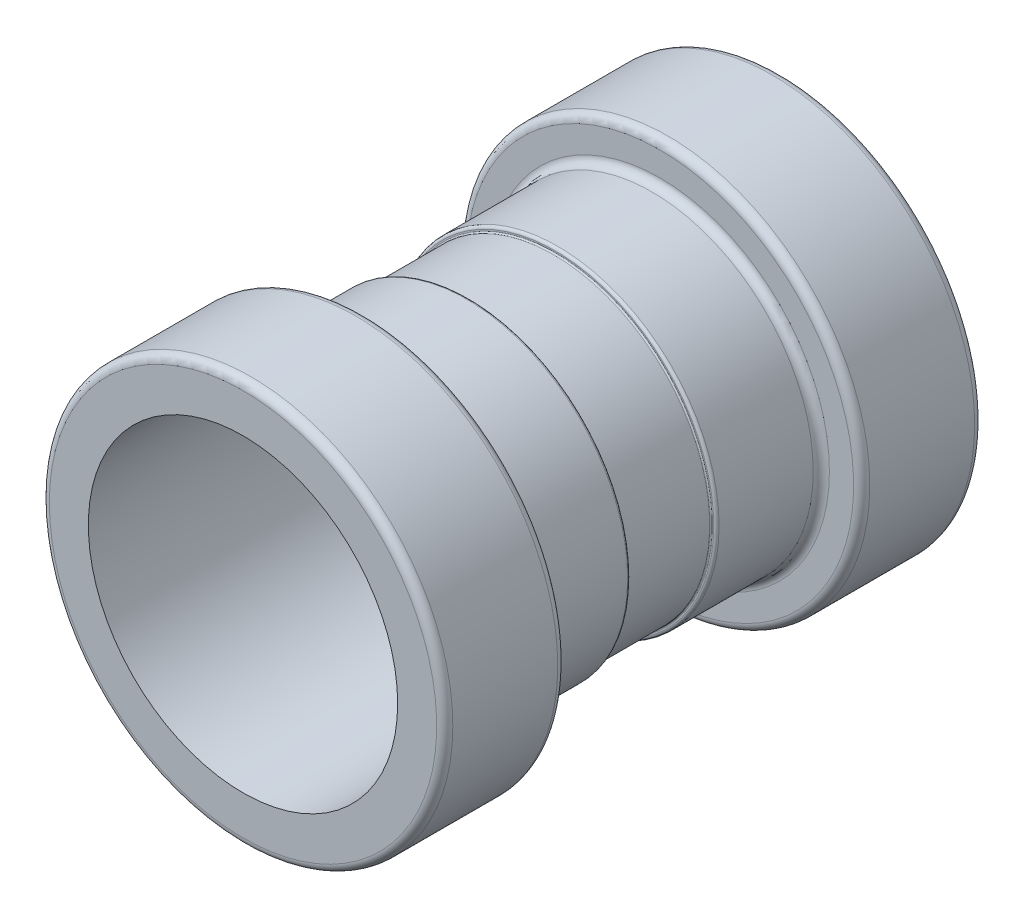
ISO-10303-21;
HEADER;
FILE_DESCRIPTION(('STEP AP214'),'2;1');
FILE_NAME('part.step','',(''),(''),'','','');
FILE_SCHEMA(('AUTOMOTIVE_DESIGN { 1 0 10303 214 1 1 1 1 }'));
ENDSEC;
DATA;
#1=APPLICATION_CONTEXT('core data for automotive mechanical design processes');
#2=APPLICATION_PROTOCOL_DEFINITION('international standard','automotive_design',2000,#1);
#3=PRODUCT_CONTEXT('',#1,'mechanical');
#4=PRODUCT('Part','Part','',(#3));
#5=PRODUCT_RELATED_PRODUCT_CATEGORY('part','',(#4));
#6=PRODUCT_DEFINITION_FORMATION('','',#4);
#7=PRODUCT_DEFINITION_CONTEXT('part definition',#1,'design');
#8=PRODUCT_DEFINITION('design','',#6,#7);
#9=PRODUCT_DEFINITION_SHAPE('','',#8);
#10=(LENGTH_UNIT() NAMED_UNIT(*) SI_UNIT(.MILLI.,.METRE.));
#11=(NAMED_UNIT(*) PLANE_ANGLE_UNIT() SI_UNIT($,.RADIAN.));
#12=(NAMED_UNIT(*) SI_UNIT($,.STERADIAN.) SOLID_ANGLE_UNIT());
#13=UNCERTAINTY_MEASURE_WITH_UNIT(LENGTH_MEASURE(1.E-05),#10,'distance_accuracy_value','');
#14=(GEOMETRIC_REPRESENTATION_CONTEXT(3) GLOBAL_UNCERTAINTY_ASSIGNED_CONTEXT((#13)) GLOBAL_UNIT_ASSIGNED_CONTEXT((#10,
#11,#12)) REPRESENTATION_CONTEXT('',''));
#15=CARTESIAN_POINT('',(0.,0.,0.));
#16=DIRECTION('',(0.,0.,1.));
#17=DIRECTION('',(1.,0.,0.));
#18=AXIS2_PLACEMENT_3D('',#15,#16,#17);
#19=CARTESIAN_POINT('',(0.,0.,-17.));
#20=DIRECTION('',(0.,0.,-1.));
#21=DIRECTION('',(-1.,0.,0.));
#22=AXIS2_PLACEMENT_3D('',#19,#20,#21);
#23=TOROIDAL_SURFACE('',#22,59.,1.);
#24=CARTESIAN_POINT('',(0.,0.,-17.));
#25=DIRECTION('',(0.,0.,-1.));
#26=DIRECTION('',(-1.,0.,0.));
#27=AXIS2_PLACEMENT_3D('',#24,#25,#26);
#28=CIRCLE('',#27,60.);
#29=CARTESIAN_POINT('',(-60.,0.,-17.));
#30=VERTEX_POINT('',#29);
#31=EDGE_CURVE('E98',#30,#30,#28,.T.);
#32=ORIENTED_EDGE('',*,*,#31,.F.);
#33=EDGE_LOOP('',(#32));
#34=FACE_BOUND('',#33,.T.);
#35=CARTESIAN_POINT('',(0.,0.,-16.));
#36=DIRECTION('',(0.,0.,-1.));
#37=DIRECTION('',(-1.,0.,0.));
#38=AXIS2_PLACEMENT_3D('',#35,#36,#37);
#39=CIRCLE('',#38,59.);
#40=CARTESIAN_POINT('',(-59.,0.,-16.));
#41=VERTEX_POINT('',#40);
#42=EDGE_CURVE('E10',#41,#41,#39,.T.);
#43=ORIENTED_EDGE('',*,*,#42,.T.);
#44=EDGE_LOOP('',(#43));
#45=FACE_BOUND('',#44,.T.);
#46=ADVANCED_FACE('F34',(#34,#45),#23,.T.);
#47=CARTESIAN_POINT('',(0.,1.11022302462518E-13,-16.));
#48=DIRECTION('',(0.,0.,-1.));
#49=DIRECTION('',(-1.,0.,0.));
#50=AXIS2_PLACEMENT_3D('',#47,#48,#49);
#51=PLANE('',#50);
#52=ORIENTED_EDGE('',*,*,#42,.F.);
#53=EDGE_LOOP('',(#52));
#54=FACE_BOUND('',#53,.T.);
#55=CARTESIAN_POINT('',(0.,0.,-16.));
#56=DIRECTION('',(0.,0.,-1.));
#57=DIRECTION('',(-1.,0.,0.));
#58=AXIS2_PLACEMENT_3D('',#55,#56,#57);
#59=CIRCLE('',#58,58.5);
#60=CARTESIAN_POINT('',(-58.5,0.,-16.));
#61=VERTEX_POINT('',#60);
#62=EDGE_CURVE('E40',#61,#61,#59,.T.);
#63=ORIENTED_EDGE('',*,*,#62,.T.);
#64=EDGE_LOOP('',(#63));
#65=FACE_BOUND('',#64,.T.);
#66=ADVANCED_FACE('F143',(#54,#65),#51,.F.);
#67=CARTESIAN_POINT('',(0.,0.,-15.5));
#68=DIRECTION('',(0.,0.,-1.));
#69=DIRECTION('',(-1.,0.,0.));
#70=AXIS2_PLACEMENT_3D('',#67,#68,#69);
#71=TOROIDAL_SURFACE('',#70,58.5,0.500000000000002);
#72=ORIENTED_EDGE('',*,*,#62,.F.);
#73=EDGE_LOOP('',(#72));
#74=FACE_BOUND('',#73,.T.);
#75=CARTESIAN_POINT('',(0.,0.,-15.5));
#76=DIRECTION('',(0.,0.,-1.));
#77=DIRECTION('',(-1.,0.,0.));
#78=AXIS2_PLACEMENT_3D('',#75,#76,#77);
#79=CIRCLE('',#78,58.);
#80=CARTESIAN_POINT('',(-58.,0.,-15.5));
#81=VERTEX_POINT('',#80);
#82=EDGE_CURVE('E44',#81,#81,#79,.T.);
#83=ORIENTED_EDGE('',*,*,#82,.T.);
#84=EDGE_LOOP('',(#83));
#85=FACE_BOUND('',#84,.T.);
#86=ADVANCED_FACE('F148',(#74,#85),#71,.F.);
#87=CARTESIAN_POINT('',(0.,0.,0.));
#88=DIRECTION('',(0.,0.,-1.));
#89=DIRECTION('',(-1.,0.,0.));
#90=AXIS2_PLACEMENT_3D('',#87,#88,#89);
#91=CYLINDRICAL_SURFACE('',#90,58.);
#92=CARTESIAN_POINT('',(0.,0.,15.5));
#93=DIRECTION('',(0.,0.,-1.));
#94=DIRECTION('',(-1.,0.,0.));
#95=AXIS2_PLACEMENT_3D('',#92,#93,#94);
#96=CIRCLE('',#95,58.);
#97=CARTESIAN_POINT('',(-58.,0.,15.5));
#98=VERTEX_POINT('',#97);
#99=EDGE_CURVE('E48',#98,#98,#96,.T.);
#100=ORIENTED_EDGE('',*,*,#99,.T.);
#101=EDGE_LOOP('',(#100));
#102=FACE_BOUND('',#101,.T.);
#103=ORIENTED_EDGE('',*,*,#82,.F.);
#104=EDGE_LOOP('',(#103));
#105=FACE_BOUND('',#104,.T.);
#106=ADVANCED_FACE('F293',(#102,#105),#91,.T.);
#107=CARTESIAN_POINT('',(0.,0.,15.5));
#108=DIRECTION('',(0.,0.,-1.));
#109=DIRECTION('',(-1.,0.,0.));
#110=AXIS2_PLACEMENT_3D('',#107,#108,#109);
#111=TOROIDAL_SURFACE('',#110,58.5,0.500000000000002);
#112=CARTESIAN_POINT('',(0.,0.,16.));
#113=DIRECTION('',(0.,0.,-1.));
#114=DIRECTION('',(-1.,0.,0.));
#115=AXIS2_PLACEMENT_3D('',#112,#113,#114);
#116=CIRCLE('',#115,58.5);
#117=CARTESIAN_POINT('',(-58.5,0.,16.));
#118=VERTEX_POINT('',#117);
#119=EDGE_CURVE('E53',#118,#118,#116,.T.);
#120=ORIENTED_EDGE('',*,*,#119,.T.);
#121=EDGE_LOOP('',(#120));
#122=FACE_BOUND('',#121,.T.);
#123=ORIENTED_EDGE('',*,*,#99,.F.);
#124=EDGE_LOOP('',(#123));
#125=FACE_BOUND('',#124,.T.);
#126=ADVANCED_FACE('F284',(#122,#125),#111,.F.);
#127=CARTESIAN_POINT('',(0.,1.11022302462518E-13,16.));
#128=DIRECTION('',(0.,0.,-1.));
#129=DIRECTION('',(-1.,0.,0.));
#130=AXIS2_PLACEMENT_3D('',#127,#128,#129);
#131=PLANE('',#130);
#132=CARTESIAN_POINT('',(0.,0.,16.));
#133=DIRECTION('',(0.,0.,-1.));
#134=DIRECTION('',(-1.,0.,0.));
#135=AXIS2_PLACEMENT_3D('',#132,#133,#134);
#136=CIRCLE('',#135,59.);
#137=CARTESIAN_POINT('',(-59.,0.,16.));
#138=VERTEX_POINT('',#137);
#139=EDGE_CURVE('E56',#138,#138,#136,.T.);
#140=ORIENTED_EDGE('',*,*,#139,.T.);
#141=EDGE_LOOP('',(#140));
#142=FACE_BOUND('',#141,.T.);
#143=ORIENTED_EDGE('',*,*,#119,.F.);
#144=EDGE_LOOP('',(#143));
#145=FACE_BOUND('',#144,.T.);
#146=ADVANCED_FACE('F275',(#142,#145),#131,.T.);
#147=CARTESIAN_POINT('',(0.,0.,17.));
#148=DIRECTION('',(0.,0.,-1.));
#149=DIRECTION('',(-1.,0.,0.));
#150=AXIS2_PLACEMENT_3D('',#147,#148,#149);
#151=TOROIDAL_SURFACE('',#150,59.,1.);
#152=CARTESIAN_POINT('',(0.,0.,17.));
#153=DIRECTION('',(0.,0.,-1.));
#154=DIRECTION('',(-1.,0.,0.));
#155=AXIS2_PLACEMENT_3D('',#152,#153,#154);
#156=CIRCLE('',#155,60.);
#157=CARTESIAN_POINT('',(-60.,0.,17.));
#158=VERTEX_POINT('',#157);
#159=EDGE_CURVE('E59',#158,#158,#156,.T.);
#160=ORIENTED_EDGE('',*,*,#159,.T.);
#161=EDGE_LOOP('',(#160));
#162=FACE_BOUND('',#161,.T.);
#163=ORIENTED_EDGE('',*,*,#139,.F.);
#164=EDGE_LOOP('',(#163));
#165=FACE_BOUND('',#164,.T.);
#166=ADVANCED_FACE('F266',(#162,#165),#151,.T.);
#167=CARTESIAN_POINT('',(0.,0.,0.));
#168=DIRECTION('',(0.,0.,-1.));
#169=DIRECTION('',(-1.,0.,0.));
#170=AXIS2_PLACEMENT_3D('',#167,#168,#169);
#171=CYLINDRICAL_SURFACE('',#170,60.);
#172=CARTESIAN_POINT('',(0.,0.,52.));
#173=DIRECTION('',(0.,0.,-1.));
#174=DIRECTION('',(-1.,0.,0.));
#175=AXIS2_PLACEMENT_3D('',#172,#173,#174);
#176=CIRCLE('',#175,60.);
#177=CARTESIAN_POINT('',(-60.,0.,52.));
#178=VERTEX_POINT('',#177);
#179=EDGE_CURVE('E62',#178,#178,#176,.T.);
#180=ORIENTED_EDGE('',*,*,#179,.T.);
#181=EDGE_LOOP('',(#180));
#182=FACE_BOUND('',#181,.T.);
#183=ORIENTED_EDGE('',*,*,#159,.F.);
#184=EDGE_LOOP('',(#183));
#185=FACE_BOUND('',#184,.T.);
#186=ADVANCED_FACE('F257',(#182,#185),#171,.T.);
#187=CARTESIAN_POINT('',(0.,0.,52.));
#188=DIRECTION('',(0.,0.,-1.));
#189=DIRECTION('',(-1.,0.,0.));
#190=AXIS2_PLACEMENT_3D('',#187,#188,#189);
#191=TOROIDAL_SURFACE('',#190,63.,2.99999999999999);
#192=ORIENTED_EDGE('',*,*,#179,.F.);
#193=EDGE_LOOP('',(#192));
#194=FACE_BOUND('',#193,.T.);
#195=CARTESIAN_POINT('',(0.,0.,55.));
#196=DIRECTION('',(0.,0.,-1.));
#197=DIRECTION('',(-1.,0.,0.));
#198=AXIS2_PLACEMENT_3D('',#195,#196,#197);
#199=CIRCLE('',#198,63.);
#200=CARTESIAN_POINT('',(-63.,0.,55.));
#201=VERTEX_POINT('',#200);
#202=EDGE_CURVE('E65',#201,#201,#199,.T.);
#203=ORIENTED_EDGE('',*,*,#202,.T.);
#204=EDGE_LOOP('',(#203));
#205=FACE_BOUND('',#204,.T.);
#206=ADVANCED_FACE('F248',(#194,#205),#191,.F.);
#207=CARTESIAN_POINT('',(0.,0.,55.));
#208=DIRECTION('',(0.,0.,1.));
#209=DIRECTION('',(1.,0.,0.));
#210=AXIS2_PLACEMENT_3D('',#207,#208,#209);
#211=PLANE('',#210);
#212=ORIENTED_EDGE('',*,*,#202,.F.);
#213=EDGE_LOOP('',(#212));
#214=FACE_BOUND('',#213,.T.);
#215=CARTESIAN_POINT('',(0.,0.,55.));
#216=DIRECTION('',(0.,0.,-1.));
#217=DIRECTION('',(-1.,0.,0.));
#218=AXIS2_PLACEMENT_3D('',#215,#216,#217);
#219=CIRCLE('',#218,72.);
#220=CARTESIAN_POINT('',(-72.,0.,55.));
#221=VERTEX_POINT('',#220);
#222=EDGE_CURVE('E68',#221,#221,#219,.T.);
#223=ORIENTED_EDGE('',*,*,#222,.T.);
#224=EDGE_LOOP('',(#223));
#225=FACE_BOUND('',#224,.T.);
#226=ADVANCED_FACE('F138',(#214,#225),#211,.F.);
#227=CARTESIAN_POINT('',(0.,0.,58.));
#228=DIRECTION('',(0.,0.,-1.));
#229=DIRECTION('',(-1.,0.,0.));
#230=AXIS2_PLACEMENT_3D('',#227,#228,#229);
#231=TOROIDAL_SURFACE('',#230,72.,3.);
#232=ORIENTED_EDGE('',*,*,#222,.F.);
#233=EDGE_LOOP('',(#232));
#234=FACE_BOUND('',#233,.T.);
#235=CARTESIAN_POINT('',(0.,0.,58.));
#236=DIRECTION('',(0.,0.,-1.));
#237=DIRECTION('',(-1.,0.,0.));
#238=AXIS2_PLACEMENT_3D('',#235,#236,#237);
#239=CIRCLE('',#238,75.);
#240=CARTESIAN_POINT('',(-75.,0.,58.));
#241=VERTEX_POINT('',#240);
#242=EDGE_CURVE('E71',#241,#241,#239,.T.);
#243=ORIENTED_EDGE('',*,*,#242,.T.);
#244=EDGE_LOOP('',(#243));
#245=FACE_BOUND('',#244,.T.);
#246=ADVANCED_FACE('F132',(#234,#245),#231,.T.);
#247=CARTESIAN_POINT('',(0.,0.,0.));
#248=DIRECTION('',(0.,0.,-1.));
#249=DIRECTION('',(-1.,0.,0.));
#250=AXIS2_PLACEMENT_3D('',#247,#248,#249);
#251=CYLINDRICAL_SURFACE('',#250,75.);
#252=ORIENTED_EDGE('',*,*,#242,.F.);
#253=EDGE_LOOP('',(#252));
#254=FACE_BOUND('',#253,.T.);
#255=CARTESIAN_POINT('',(0.,0.,97.));
#256=DIRECTION('',(0.,0.,-1.));
#257=DIRECTION('',(-1.,0.,0.));
#258=AXIS2_PLACEMENT_3D('',#255,#256,#257);
#259=CIRCLE('',#258,75.);
#260=CARTESIAN_POINT('',(-75.,0.,97.));
#261=VERTEX_POINT('',#260);
#262=EDGE_CURVE('E74',#261,#261,#259,.T.);
#263=ORIENTED_EDGE('',*,*,#262,.T.);
#264=EDGE_LOOP('',(#263));
#265=FACE_BOUND('',#264,.T.);
#266=ADVANCED_FACE('F127',(#254,#265),#251,.T.);
#267=CARTESIAN_POINT('',(0.,0.,97.));
#268=DIRECTION('',(0.,0.,-1.));
#269=DIRECTION('',(-1.,0.,0.));
#270=AXIS2_PLACEMENT_3D('',#267,#268,#269);
#271=TOROIDAL_SURFACE('',#270,72.,3.);
#272=CARTESIAN_POINT('',(0.,0.,100.));
#273=DIRECTION('',(0.,0.,-1.));
#274=DIRECTION('',(-1.,0.,0.));
#275=AXIS2_PLACEMENT_3D('',#272,#273,#274);
#276=CIRCLE('',#275,72.);
#277=CARTESIAN_POINT('',(-72.,0.,100.));
#278=VERTEX_POINT('',#277);
#279=EDGE_CURVE('E77',#278,#278,#276,.T.);
#280=ORIENTED_EDGE('',*,*,#279,.T.);
#281=EDGE_LOOP('',(#280));
#282=FACE_BOUND('',#281,.T.);
#283=ORIENTED_EDGE('',*,*,#262,.F.);
#284=EDGE_LOOP('',(#283));
#285=FACE_BOUND('',#284,.T.);
#286=ADVANCED_FACE('F121',(#282,#285),#271,.T.);
#287=CARTESIAN_POINT('',(0.,0.,100.));
#288=DIRECTION('',(0.,0.,1.));
#289=DIRECTION('',(1.,0.,0.));
#290=AXIS2_PLACEMENT_3D('',#287,#288,#289);
#291=PLANE('',#290);
#292=CARTESIAN_POINT('',(0.,0.,100.));
#293=DIRECTION('',(0.,0.,1.));
#294=DIRECTION('',(1.,0.,0.));
#295=AXIS2_PLACEMENT_3D('',#292,#293,#294);
#296=CIRCLE('',#295,57.5);
#297=CARTESIAN_POINT('',(57.5,0.,100.));
#298=VERTEX_POINT('',#297);
#299=EDGE_CURVE('E102',#298,#298,#296,.T.);
#300=ORIENTED_EDGE('',*,*,#299,.F.);
#301=EDGE_LOOP('',(#300));
#302=FACE_BOUND('',#301,.T.);
#303=ORIENTED_EDGE('',*,*,#279,.F.);
#304=EDGE_LOOP('',(#303));
#305=FACE_BOUND('',#304,.T.);
#306=ADVANCED_FACE('F118',(#302,#305),#291,.T.);
#307=CARTESIAN_POINT('',(0.,0.,-100.));
#308=DIRECTION('',(0.,0.,1.));
#309=DIRECTION('',(1.,0.,0.));
#310=AXIS2_PLACEMENT_3D('',#307,#308,#309);
#311=PLANE('',#310);
#312=CARTESIAN_POINT('',(0.,0.,-100.));
#313=DIRECTION('',(0.,0.,1.));
#314=DIRECTION('',(1.,0.,0.));
#315=AXIS2_PLACEMENT_3D('',#312,#313,#314);
#316=CIRCLE('',#315,57.5);
#317=CARTESIAN_POINT('',(57.5,0.,-100.));
#318=VERTEX_POINT('',#317);
#319=EDGE_CURVE('E101',#318,#318,#316,.T.);
#320=ORIENTED_EDGE('',*,*,#319,.T.);
#321=EDGE_LOOP('',(#320));
#322=FACE_BOUND('',#321,.T.);
#323=CARTESIAN_POINT('',(0.,0.,-100.));
#324=DIRECTION('',(0.,0.,-1.));
#325=DIRECTION('',(-1.,0.,0.));
#326=AXIS2_PLACEMENT_3D('',#323,#324,#325);
#327=CIRCLE('',#326,72.);
#328=CARTESIAN_POINT('',(-72.,0.,-100.));
#329=VERTEX_POINT('',#328);
#330=EDGE_CURVE('E80',#329,#329,#327,.T.);
#331=ORIENTED_EDGE('',*,*,#330,.T.);
#332=EDGE_LOOP('',(#331));
#333=FACE_BOUND('',#332,.T.);
#334=ADVANCED_FACE('F108',(#322,#333),#311,.F.);
#335=CARTESIAN_POINT('',(0.,0.,-97.));
#336=DIRECTION('',(0.,0.,-1.));
#337=DIRECTION('',(-1.,0.,0.));
#338=AXIS2_PLACEMENT_3D('',#335,#336,#337);
#339=TOROIDAL_SURFACE('',#338,72.,2.99999999999999);
#340=CARTESIAN_POINT('',(0.,0.,-97.));
#341=DIRECTION('',(0.,0.,-1.));
#342=DIRECTION('',(-1.,0.,0.));
#343=AXIS2_PLACEMENT_3D('',#340,#341,#342);
#344=CIRCLE('',#343,75.);
#345=CARTESIAN_POINT('',(-75.,0.,-97.));
#346=VERTEX_POINT('',#345);
#347=EDGE_CURVE('E83',#346,#346,#344,.T.);
#348=ORIENTED_EDGE('',*,*,#347,.T.);
#349=EDGE_LOOP('',(#348));
#350=FACE_BOUND('',#349,.T.);
#351=ORIENTED_EDGE('',*,*,#330,.F.);
#352=EDGE_LOOP('',(#351));
#353=FACE_BOUND('',#352,.T.);
#354=ADVANCED_FACE('F174',(#350,#353),#339,.T.);
#355=CARTESIAN_POINT('',(0.,0.,0.));
#356=DIRECTION('',(0.,0.,-1.));
#357=DIRECTION('',(-1.,0.,0.));
#358=AXIS2_PLACEMENT_3D('',#355,#356,#357);
#359=CYLINDRICAL_SURFACE('',#358,75.);
#360=ORIENTED_EDGE('',*,*,#347,.F.);
#361=EDGE_LOOP('',(#360));
#362=FACE_BOUND('',#361,.T.);
#363=CARTESIAN_POINT('',(0.,0.,-58.));
#364=DIRECTION('',(0.,0.,-1.));
#365=DIRECTION('',(-1.,0.,0.));
#366=AXIS2_PLACEMENT_3D('',#363,#364,#365);
#367=CIRCLE('',#366,75.);
#368=CARTESIAN_POINT('',(-75.,0.,-58.));
#369=VERTEX_POINT('',#368);
#370=EDGE_CURVE('E86',#369,#369,#367,.T.);
#371=ORIENTED_EDGE('',*,*,#370,.T.);
#372=EDGE_LOOP('',(#371));
#373=FACE_BOUND('',#372,.T.);
#374=ADVANCED_FACE('F170',(#362,#373),#359,.T.);
#375=CARTESIAN_POINT('',(0.,0.,-58.));
#376=DIRECTION('',(0.,0.,-1.));
#377=DIRECTION('',(-1.,0.,0.));
#378=AXIS2_PLACEMENT_3D('',#375,#376,#377);
#379=TOROIDAL_SURFACE('',#378,72.,3.);
#380=CARTESIAN_POINT('',(0.,0.,-55.));
#381=DIRECTION('',(0.,0.,-1.));
#382=DIRECTION('',(-1.,0.,0.));
#383=AXIS2_PLACEMENT_3D('',#380,#381,#382);
#384=CIRCLE('',#383,72.);
#385=CARTESIAN_POINT('',(-72.,0.,-55.));
#386=VERTEX_POINT('',#385);
#387=EDGE_CURVE('E89',#386,#386,#384,.T.);
#388=ORIENTED_EDGE('',*,*,#387,.T.);
#389=EDGE_LOOP('',(#388));
#390=FACE_BOUND('',#389,.T.);
#391=ORIENTED_EDGE('',*,*,#370,.F.);
#392=EDGE_LOOP('',(#391));
#393=FACE_BOUND('',#392,.T.);
#394=ADVANCED_FACE('F166',(#390,#393),#379,.T.);
#395=CARTESIAN_POINT('',(0.,0.,-55.));
#396=DIRECTION('',(0.,0.,-1.));
#397=DIRECTION('',(-1.,0.,0.));
#398=AXIS2_PLACEMENT_3D('',#395,#396,#397);
#399=PLANE('',#398);
#400=ORIENTED_EDGE('',*,*,#387,.F.);
#401=EDGE_LOOP('',(#400));
#402=FACE_BOUND('',#401,.T.);
#403=CARTESIAN_POINT('',(0.,0.,-55.));
#404=DIRECTION('',(0.,0.,-1.));
#405=DIRECTION('',(-1.,0.,0.));
#406=AXIS2_PLACEMENT_3D('',#403,#404,#405);
#407=CIRCLE('',#406,63.);
#408=CARTESIAN_POINT('',(-63.,0.,-55.));
#409=VERTEX_POINT('',#408);
#410=EDGE_CURVE('E92',#409,#409,#407,.T.);
#411=ORIENTED_EDGE('',*,*,#410,.T.);
#412=EDGE_LOOP('',(#411));
#413=FACE_BOUND('',#412,.T.);
#414=ADVANCED_FACE('F159',(#402,#413),#399,.F.);
#415=CARTESIAN_POINT('',(0.,0.,-52.));
#416=DIRECTION('',(0.,0.,-1.));
#417=DIRECTION('',(-1.,0.,0.));
#418=AXIS2_PLACEMENT_3D('',#415,#416,#417);
#419=TOROIDAL_SURFACE('',#418,63.,2.99999999999999);
#420=ORIENTED_EDGE('',*,*,#410,.F.);
#421=EDGE_LOOP('',(#420));
#422=FACE_BOUND('',#421,.T.);
#423=CARTESIAN_POINT('',(0.,0.,-52.));
#424=DIRECTION('',(0.,0.,-1.));
#425=DIRECTION('',(-1.,0.,0.));
#426=AXIS2_PLACEMENT_3D('',#423,#424,#425);
#427=CIRCLE('',#426,60.);
#428=CARTESIAN_POINT('',(-60.,0.,-52.));
#429=VERTEX_POINT('',#428);
#430=EDGE_CURVE('E95',#429,#429,#427,.T.);
#431=ORIENTED_EDGE('',*,*,#430,.T.);
#432=EDGE_LOOP('',(#431));
#433=FACE_BOUND('',#432,.T.);
#434=ADVANCED_FACE('F153',(#422,#433),#419,.F.);
#435=CARTESIAN_POINT('',(0.,0.,0.));
#436=DIRECTION('',(0.,0.,-1.));
#437=DIRECTION('',(-1.,0.,0.));
#438=AXIS2_PLACEMENT_3D('',#435,#436,#437);
#439=CYLINDRICAL_SURFACE('',#438,60.);
#440=ORIENTED_EDGE('',*,*,#430,.F.);
#441=EDGE_LOOP('',(#440));
#442=FACE_BOUND('',#441,.T.);
#443=ORIENTED_EDGE('',*,*,#31,.T.);
#444=EDGE_LOOP('',(#443));
#445=FACE_BOUND('',#444,.T.);
#446=ADVANCED_FACE('F114',(#442,#445),#439,.T.);
#447=CARTESIAN_POINT('',(0.,0.,-100.));
#448=DIRECTION('',(0.,0.,1.));
#449=DIRECTION('',(1.,0.,0.));
#450=AXIS2_PLACEMENT_3D('',#447,#448,#449);
#451=CYLINDRICAL_SURFACE('',#450,57.5);
#452=ORIENTED_EDGE('',*,*,#319,.F.);
#453=EDGE_LOOP('',(#452));
#454=FACE_BOUND('',#453,.T.);
#455=ORIENTED_EDGE('',*,*,#299,.T.);
#456=EDGE_LOOP('',(#455));
#457=FACE_BOUND('',#456,.T.);
#458=ADVANCED_FACE('F111',(#454,#457),#451,.F.);
#459=CLOSED_SHELL('',(#46,#66,#86,#106,#126,#146,#166,#186,#206,#226,#246,#266,#286,#306,#334,
#354,#374,#394,#414,#434,#446,#458));
#460=MANIFOLD_SOLID_BREP('B2',#459);
#461=ADVANCED_BREP_SHAPE_REPRESENTATION('',(#18,#460),#14);
#462=SHAPE_DEFINITION_REPRESENTATION(#9,#461);
ENDSEC;
END-ISO-10303-21;
